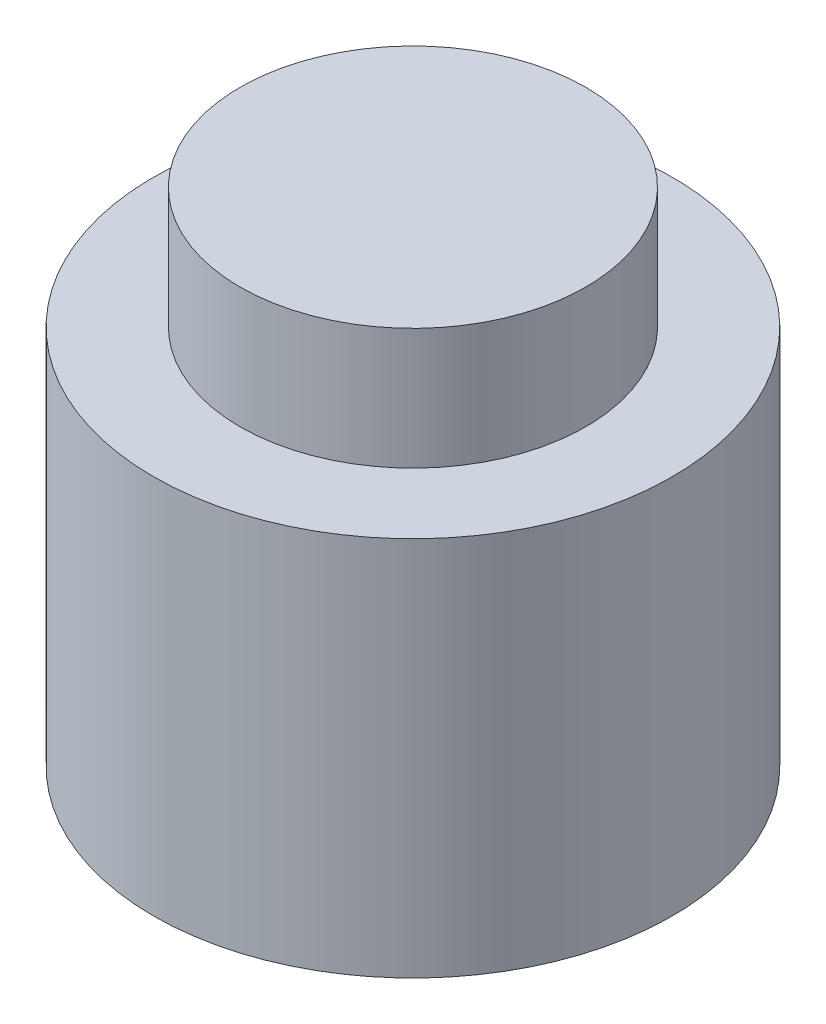
ISO-10303-21;
HEADER;
FILE_DESCRIPTION(('STEP AP214'),'2;1');
FILE_NAME('part.step','',(''),(''),'','','');
FILE_SCHEMA(('AUTOMOTIVE_DESIGN { 1 0 10303 214 1 1 1 1 }'));
ENDSEC;
DATA;
#1=APPLICATION_CONTEXT('core data for automotive mechanical design processes');
#2=APPLICATION_PROTOCOL_DEFINITION('international standard','automotive_design',2000,#1);
#3=PRODUCT_CONTEXT('',#1,'mechanical');
#4=PRODUCT('Part','Part','',(#3));
#5=PRODUCT_RELATED_PRODUCT_CATEGORY('part','',(#4));
#6=PRODUCT_DEFINITION_FORMATION('','',#4);
#7=PRODUCT_DEFINITION_CONTEXT('part definition',#1,'design');
#8=PRODUCT_DEFINITION('design','',#6,#7);
#9=PRODUCT_DEFINITION_SHAPE('','',#8);
#10=(LENGTH_UNIT() NAMED_UNIT(*) SI_UNIT(.MILLI.,.METRE.));
#11=(NAMED_UNIT(*) PLANE_ANGLE_UNIT() SI_UNIT($,.RADIAN.));
#12=(NAMED_UNIT(*) SI_UNIT($,.STERADIAN.) SOLID_ANGLE_UNIT());
#13=UNCERTAINTY_MEASURE_WITH_UNIT(LENGTH_MEASURE(1.E-05),#10,'distance_accuracy_value','');
#14=(GEOMETRIC_REPRESENTATION_CONTEXT(3) GLOBAL_UNCERTAINTY_ASSIGNED_CONTEXT((#13)) GLOBAL_UNIT_ASSIGNED_CONTEXT((#10,
#11,#12)) REPRESENTATION_CONTEXT('',''));
#15=CARTESIAN_POINT('',(0.,0.,0.));
#16=DIRECTION('',(0.,0.,1.));
#17=DIRECTION('',(1.,0.,0.));
#18=AXIS2_PLACEMENT_3D('',#15,#16,#17);
#19=CARTESIAN_POINT('',(0.,22.,0.));
#20=DIRECTION('',(0.,-1.,0.));
#21=DIRECTION('',(0.,0.,-1.));
#22=AXIS2_PLACEMENT_3D('',#19,#20,#21);
#23=CYLINDRICAL_SURFACE('',#22,15.);
#24=CARTESIAN_POINT('',(0.,22.,0.));
#25=DIRECTION('',(0.,1.,0.));
#26=DIRECTION('',(0.,0.,1.));
#27=AXIS2_PLACEMENT_3D('',#24,#25,#26);
#28=CIRCLE('',#27,15.);
#29=CARTESIAN_POINT('',(0.,22.,15.));
#30=VERTEX_POINT('',#29);
#31=EDGE_CURVE('E10',#30,#30,#28,.T.);
#32=ORIENTED_EDGE('',*,*,#31,.F.);
#33=EDGE_LOOP('',(#32));
#34=FACE_BOUND('',#33,.T.);
#35=CARTESIAN_POINT('',(0.,0.,0.));
#36=DIRECTION('',(0.,1.,0.));
#37=DIRECTION('',(0.,0.,1.));
#38=AXIS2_PLACEMENT_3D('',#35,#36,#37);
#39=CIRCLE('',#38,15.);
#40=CARTESIAN_POINT('',(0.,0.,15.));
#41=VERTEX_POINT('',#40);
#42=EDGE_CURVE('E34',#41,#41,#39,.T.);
#43=ORIENTED_EDGE('',*,*,#42,.T.);
#44=EDGE_LOOP('',(#43));
#45=FACE_BOUND('',#44,.T.);
#46=ADVANCED_FACE('F31',(#34,#45),#23,.T.);
#47=CARTESIAN_POINT('',(0.,22.,0.));
#48=DIRECTION('',(0.,1.,0.));
#49=DIRECTION('',(0.,0.,1.));
#50=AXIS2_PLACEMENT_3D('',#47,#48,#49);
#51=PLANE('',#50);
#52=CARTESIAN_POINT('',(0.,22.,0.));
#53=DIRECTION('',(0.,1.,0.));
#54=DIRECTION('',(0.,0.,1.));
#55=AXIS2_PLACEMENT_3D('',#52,#53,#54);
#56=CIRCLE('',#55,10.);
#57=CARTESIAN_POINT('',(0.,22.,10.));
#58=VERTEX_POINT('',#57);
#59=EDGE_CURVE('E43',#58,#58,#56,.T.);
#60=ORIENTED_EDGE('',*,*,#59,.F.);
#61=EDGE_LOOP('',(#60));
#62=FACE_BOUND('',#61,.T.);
#63=ORIENTED_EDGE('',*,*,#31,.T.);
#64=EDGE_LOOP('',(#63));
#65=FACE_BOUND('',#64,.T.);
#66=ADVANCED_FACE('F58',(#62,#65),#51,.T.);
#67=CARTESIAN_POINT('',(0.,0.,0.));
#68=DIRECTION('',(0.,1.,0.));
#69=DIRECTION('',(0.,0.,1.));
#70=AXIS2_PLACEMENT_3D('',#67,#68,#69);
#71=PLANE('',#70);
#72=ORIENTED_EDGE('',*,*,#42,.F.);
#73=EDGE_LOOP('',(#72));
#74=FACE_BOUND('',#73,.T.);
#75=ADVANCED_FACE('F54',(#74),#71,.F.);
#76=CARTESIAN_POINT('',(0.,29.,0.));
#77=DIRECTION('',(0.,-1.,0.));
#78=DIRECTION('',(0.,0.,-1.));
#79=AXIS2_PLACEMENT_3D('',#76,#77,#78);
#80=CYLINDRICAL_SURFACE('',#79,10.);
#81=CARTESIAN_POINT('',(0.,29.,0.));
#82=DIRECTION('',(0.,1.,0.));
#83=DIRECTION('',(0.,0.,1.));
#84=AXIS2_PLACEMENT_3D('',#81,#82,#83);
#85=CIRCLE('',#84,10.);
#86=CARTESIAN_POINT('',(0.,29.,10.));
#87=VERTEX_POINT('',#86);
#88=EDGE_CURVE('E41',#87,#87,#85,.T.);
#89=ORIENTED_EDGE('',*,*,#88,.F.);
#90=EDGE_LOOP('',(#89));
#91=FACE_BOUND('',#90,.T.);
#92=ORIENTED_EDGE('',*,*,#59,.T.);
#93=EDGE_LOOP('',(#92));
#94=FACE_BOUND('',#93,.T.);
#95=ADVANCED_FACE('F51',(#91,#94),#80,.T.);
#96=CARTESIAN_POINT('',(0.,29.,0.));
#97=DIRECTION('',(0.,1.,0.));
#98=DIRECTION('',(0.,0.,1.));
#99=AXIS2_PLACEMENT_3D('',#96,#97,#98);
#100=PLANE('',#99);
#101=ORIENTED_EDGE('',*,*,#88,.T.);
#102=EDGE_LOOP('',(#101));
#103=FACE_BOUND('',#102,.T.);
#104=ADVANCED_FACE('F49',(#103),#100,.T.);
#105=CLOSED_SHELL('',(#46,#66,#75,#95,#104));
#106=MANIFOLD_SOLID_BREP('B2',#105);
#107=ADVANCED_BREP_SHAPE_REPRESENTATION('',(#18,#106),#14);
#108=SHAPE_DEFINITION_REPRESENTATION(#9,#107);
ENDSEC;
END-ISO-10303-21;
